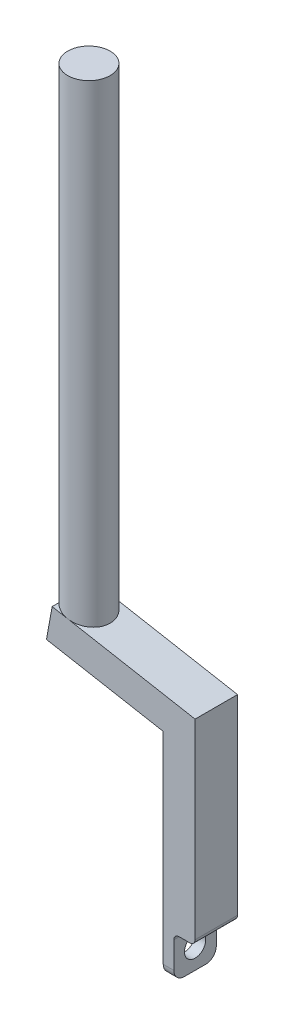
ISO-10303-21;
HEADER;
FILE_DESCRIPTION(('STEP AP214'),'2;1');
FILE_NAME('part.step','',(''),(''),'','','');
FILE_SCHEMA(('AUTOMOTIVE_DESIGN { 1 0 10303 214 1 1 1 1 }'));
ENDSEC;
DATA;
#1=APPLICATION_CONTEXT('core data for automotive mechanical design processes');
#2=APPLICATION_PROTOCOL_DEFINITION('international standard','automotive_design',2000,#1);
#3=PRODUCT_CONTEXT('',#1,'mechanical');
#4=PRODUCT('Part','Part','',(#3));
#5=PRODUCT_RELATED_PRODUCT_CATEGORY('part','',(#4));
#6=PRODUCT_DEFINITION_FORMATION('','',#4);
#7=PRODUCT_DEFINITION_CONTEXT('part definition',#1,'design');
#8=PRODUCT_DEFINITION('design','',#6,#7);
#9=PRODUCT_DEFINITION_SHAPE('','',#8);
#10=(LENGTH_UNIT() NAMED_UNIT(*) SI_UNIT(.MILLI.,.METRE.));
#11=(NAMED_UNIT(*) PLANE_ANGLE_UNIT() SI_UNIT($,.RADIAN.));
#12=(NAMED_UNIT(*) SI_UNIT($,.STERADIAN.) SOLID_ANGLE_UNIT());
#13=UNCERTAINTY_MEASURE_WITH_UNIT(LENGTH_MEASURE(1.E-05),#10,'distance_accuracy_value','');
#14=(GEOMETRIC_REPRESENTATION_CONTEXT(3) GLOBAL_UNCERTAINTY_ASSIGNED_CONTEXT((#13)) GLOBAL_UNIT_ASSIGNED_CONTEXT((#10,
#11,#12)) REPRESENTATION_CONTEXT('',''));
#15=CARTESIAN_POINT('',(0.,0.,0.));
#16=DIRECTION('',(0.,0.,1.));
#17=DIRECTION('',(1.,0.,0.));
#18=AXIS2_PLACEMENT_3D('',#15,#16,#17);
#19=CARTESIAN_POINT('',(-14.6334368540004,29.5160973029974,-20.));
#20=DIRECTION('',(0.178885438199985,0.983869910099907,0.));
#21=DIRECTION('',(-0.983869910099907,0.178885438199985,0.));
#22=AXIS2_PLACEMENT_3D('',#19,#20,#21);
#23=PLANE('',#22);
#24=CARTESIAN_POINT('',(0.,26.8554724204519,0.));
#25=DIRECTION('',(0.178885438199985,0.983869910099907,0.));
#26=DIRECTION('',(0.983869910099907,-0.178885438199985,0.));
#27=AXIS2_PLACEMENT_3D('',#24,#25,#26);
#28=ELLIPSE('',#27,20.3278907045436,20.);
#29=CARTESIAN_POINT('',(0.,26.8554724204519,-20.));
#30=VERTEX_POINT('',#29);
#31=CARTESIAN_POINT('',(-14.6334368540004,29.5160973029974,-13.6331407181171));
#32=VERTEX_POINT('',#31);
#33=EDGE_CURVE('E209',#30,#32,#28,.T.);
#34=ORIENTED_EDGE('',*,*,#33,.F.);
#35=DIRECTION('',(-0.983869910099907,0.178885438199985,0.));
#36=VECTOR('',#35,1.);
#37=CARTESIAN_POINT('',(-14.6334368540004,29.5160973029974,-20.));
#38=LINE('',#37,#36);
#39=CARTESIAN_POINT('',(-14.6334368540004,29.5160973029974,-20.));
#40=VERTEX_POINT('',#39);
#41=EDGE_CURVE('E188',#30,#40,#38,.T.);
#42=ORIENTED_EDGE('',*,*,#41,.T.);
#43=DIRECTION('',(0.,0.,1.));
#44=VECTOR('',#43,1.);
#45=CARTESIAN_POINT('',(-14.6334368540004,29.5160973029974,-20.));
#46=LINE('',#45,#44);
#47=EDGE_CURVE('E190',#40,#32,#46,.T.);
#48=ORIENTED_EDGE('',*,*,#47,.T.);
#49=EDGE_LOOP('',(#34,#42,#48));
#50=FACE_BOUND('',#49,.T.);
#51=ADVANCED_FACE('F33',(#50),#23,.T.);
#52=CARTESIAN_POINT('',(-14.6334368540004,29.5160973029974,13.6331407181171));
#53=VERTEX_POINT('',#52);
#54=CARTESIAN_POINT('',(0.,26.8554724204519,20.));
#55=VERTEX_POINT('',#54);
#56=EDGE_CURVE('E210',#53,#55,#28,.T.);
#57=ORIENTED_EDGE('',*,*,#56,.F.);
#58=CARTESIAN_POINT('',(-14.6334368540004,29.5160973029974,20.));
#59=VERTEX_POINT('',#58);
#60=EDGE_CURVE('E194',#53,#59,#46,.T.);
#61=ORIENTED_EDGE('',*,*,#60,.T.);
#62=DIRECTION('',(-0.983869910099907,0.178885438199985,0.));
#63=VECTOR('',#62,1.);
#64=CARTESIAN_POINT('',(-14.6334368540004,29.5160973029974,20.));
#65=LINE('',#64,#63);
#66=EDGE_CURVE('E166',#55,#59,#65,.T.);
#67=ORIENTED_EDGE('',*,*,#66,.F.);
#68=EDGE_LOOP('',(#57,#61,#67));
#69=FACE_BOUND('',#68,.T.);
#70=ADVANCED_FACE('F310',(#69),#23,.T.);
#71=CARTESIAN_POINT('',(-20.,0.,-20.));
#72=DIRECTION('',(-0.983869910099907,0.178885438199984,0.));
#73=DIRECTION('',(-0.178885438199984,-0.983869910099907,0.));
#74=AXIS2_PLACEMENT_3D('',#71,#72,#73);
#75=PLANE('',#74);
#76=CARTESIAN_POINT('',(0.,110.,0.));
#77=DIRECTION('',(-0.983869910099907,0.178885438199984,0.));
#78=DIRECTION('',(-0.178885438199984,-0.983869910099907,0.));
#79=AXIS2_PLACEMENT_3D('',#76,#77,#78);
#80=ELLIPSE('',#79,111.803398874989,20.);
#81=CARTESIAN_POINT('',(-20.,0.,0.));
#82=VERTEX_POINT('',#81);
#83=EDGE_CURVE('E148',#82,#53,#80,.T.);
#84=ORIENTED_EDGE('',*,*,#83,.F.);
#85=DIRECTION('',(0.,0.,1.));
#86=VECTOR('',#85,1.);
#87=CARTESIAN_POINT('',(-20.,0.,-20.));
#88=LINE('',#87,#86);
#89=CARTESIAN_POINT('',(-20.,0.,20.));
#90=VERTEX_POINT('',#89);
#91=EDGE_CURVE('E141',#82,#90,#88,.T.);
#92=ORIENTED_EDGE('',*,*,#91,.T.);
#93=DIRECTION('',(-0.178885438199984,-0.983869910099907,0.));
#94=VECTOR('',#93,1.);
#95=CARTESIAN_POINT('',(-20.,0.,20.));
#96=LINE('',#95,#94);
#97=EDGE_CURVE('E146',#59,#90,#96,.T.);
#98=ORIENTED_EDGE('',*,*,#97,.F.);
#99=ORIENTED_EDGE('',*,*,#60,.F.);
#100=EDGE_LOOP('',(#84,#92,#98,#99));
#101=FACE_BOUND('',#100,.T.);
#102=ADVANCED_FACE('F143',(#101),#75,.T.);
#103=EDGE_CURVE('E193',#32,#82,#80,.T.);
#104=ORIENTED_EDGE('',*,*,#103,.F.);
#105=ORIENTED_EDGE('',*,*,#47,.F.);
#106=DIRECTION('',(-0.178885438199984,-0.983869910099907,0.));
#107=VECTOR('',#106,1.);
#108=CARTESIAN_POINT('',(-20.,0.,-20.));
#109=LINE('',#108,#107);
#110=CARTESIAN_POINT('',(-20.,0.,-20.));
#111=VERTEX_POINT('',#110);
#112=EDGE_CURVE('E179',#40,#111,#109,.T.);
#113=ORIENTED_EDGE('',*,*,#112,.T.);
#114=EDGE_CURVE('E151',#111,#82,#88,.T.);
#115=ORIENTED_EDGE('',*,*,#114,.T.);
#116=EDGE_LOOP('',(#104,#105,#113,#115));
#117=FACE_BOUND('',#116,.T.);
#118=ADVANCED_FACE('F301',(#117),#75,.T.);
#119=EDGE_CURVE('E206',#55,#30,#28,.T.);
#120=ORIENTED_EDGE('',*,*,#119,.F.);
#121=CARTESIAN_POINT('',(120.,5.03729060226981,20.));
#122=VERTEX_POINT('',#121);
#123=EDGE_CURVE('E177',#122,#55,#65,.T.);
#124=ORIENTED_EDGE('',*,*,#123,.F.);
#125=DIRECTION('',(0.,0.,1.));
#126=VECTOR('',#125,1.);
#127=CARTESIAN_POINT('',(120.,5.03729060226981,-20.));
#128=LINE('',#127,#126);
#129=CARTESIAN_POINT('',(120.,5.03729060226981,-20.));
#130=VERTEX_POINT('',#129);
#131=EDGE_CURVE('E195',#130,#122,#128,.T.);
#132=ORIENTED_EDGE('',*,*,#131,.F.);
#133=EDGE_CURVE('E152',#130,#30,#38,.T.);
#134=ORIENTED_EDGE('',*,*,#133,.T.);
#135=EDGE_LOOP('',(#120,#124,#132,#134));
#136=FACE_BOUND('',#135,.T.);
#137=ADVANCED_FACE('F289',(#136),#23,.T.);
#138=CARTESIAN_POINT('',(120.,5.03729060226981,-20.));
#139=DIRECTION('',(1.,0.,0.));
#140=DIRECTION('',(0.,1.,0.));
#141=AXIS2_PLACEMENT_3D('',#138,#139,#140);
#142=PLANE('',#141);
#143=DIRECTION('',(0.,1.,0.));
#144=VECTOR('',#143,1.);
#145=CARTESIAN_POINT('',(120.,5.03729060226981,20.));
#146=LINE('',#145,#144);
#147=CARTESIAN_POINT('',(120.,-175.,20.));
#148=VERTEX_POINT('',#147);
#149=EDGE_CURVE('E175',#148,#122,#146,.T.);
#150=ORIENTED_EDGE('',*,*,#149,.F.);
#151=DIRECTION('',(0.,0.,1.));
#152=VECTOR('',#151,1.);
#153=CARTESIAN_POINT('',(120.,-175.,-20.));
#154=LINE('',#153,#152);
#155=CARTESIAN_POINT('',(120.,-175.,-20.));
#156=VERTEX_POINT('',#155);
#157=EDGE_CURVE('E221',#148,#156,#154,.F.);
#158=ORIENTED_EDGE('',*,*,#157,.T.);
#159=DIRECTION('',(0.,1.,0.));
#160=VECTOR('',#159,1.);
#161=CARTESIAN_POINT('',(120.,5.03729060226981,-20.));
#162=LINE('',#161,#160);
#163=EDGE_CURVE('E186',#156,#130,#162,.T.);
#164=ORIENTED_EDGE('',*,*,#163,.T.);
#165=ORIENTED_EDGE('',*,*,#131,.T.);
#166=EDGE_LOOP('',(#150,#158,#164,#165));
#167=FACE_BOUND('',#166,.T.);
#168=ADVANCED_FACE('F283',(#167),#142,.T.);
#169=CARTESIAN_POINT('',(90.,-220.,-20.));
#170=DIRECTION('',(0.,-1.,0.));
#171=DIRECTION('',(0.,0.,-1.));
#172=AXIS2_PLACEMENT_3D('',#169,#170,#171);
#173=PLANE('',#172);
#174=DIRECTION('',(0.,0.,1.));
#175=VECTOR('',#174,1.);
#176=CARTESIAN_POINT('',(90.,-220.,-20.));
#177=LINE('',#176,#175);
#178=CARTESIAN_POINT('',(90.,-220.,-10.));
#179=VERTEX_POINT('',#178);
#180=CARTESIAN_POINT('',(90.,-220.,10.));
#181=VERTEX_POINT('',#180);
#182=EDGE_CURVE('E198',#179,#181,#177,.T.);
#183=ORIENTED_EDGE('',*,*,#182,.F.);
#184=DIRECTION('',(1.,0.,0.));
#185=VECTOR('',#184,1.);
#186=CARTESIAN_POINT('',(90.,-220.,-10.));
#187=LINE('',#186,#185);
#188=CARTESIAN_POINT('',(100.,-220.,-10.));
#189=VERTEX_POINT('',#188);
#190=EDGE_CURVE('E235',#179,#189,#187,.T.);
#191=ORIENTED_EDGE('',*,*,#190,.T.);
#192=DIRECTION('',(0.,0.,-1.));
#193=VECTOR('',#192,1.);
#194=CARTESIAN_POINT('',(100.,-220.,-20.));
#195=LINE('',#194,#193);
#196=CARTESIAN_POINT('',(100.,-220.,10.));
#197=VERTEX_POINT('',#196);
#198=EDGE_CURVE('E258',#197,#189,#195,.T.);
#199=ORIENTED_EDGE('',*,*,#198,.F.);
#200=DIRECTION('',(1.,0.,0.));
#201=VECTOR('',#200,1.);
#202=CARTESIAN_POINT('',(90.,-220.,10.));
#203=LINE('',#202,#201);
#204=EDGE_CURVE('E233',#197,#181,#203,.F.);
#205=ORIENTED_EDGE('',*,*,#204,.T.);
#206=EDGE_LOOP('',(#183,#191,#199,#205));
#207=FACE_BOUND('',#206,.T.);
#208=ADVANCED_FACE('F249',(#207),#173,.T.);
#209=CARTESIAN_POINT('',(90.,-20.,-20.));
#210=DIRECTION('',(-1.,0.,0.));
#211=DIRECTION('',(0.,-1.,0.));
#212=AXIS2_PLACEMENT_3D('',#209,#210,#211);
#213=PLANE('',#212);
#214=CARTESIAN_POINT('',(90.,-200.,0.));
#215=DIRECTION('',(-1.,0.,0.));
#216=DIRECTION('',(0.,-1.,0.));
#217=AXIS2_PLACEMENT_3D('',#214,#215,#216);
#218=CIRCLE('',#217,10.);
#219=CARTESIAN_POINT('',(90.,-210.,0.));
#220=VERTEX_POINT('',#219);
#221=EDGE_CURVE('E167',#220,#220,#218,.T.);
#222=ORIENTED_EDGE('',*,*,#221,.F.);
#223=EDGE_LOOP('',(#222));
#224=FACE_BOUND('',#223,.T.);
#225=DIRECTION('',(0.,-1.,0.));
#226=VECTOR('',#225,1.);
#227=CARTESIAN_POINT('',(90.,-20.,-20.));
#228=LINE('',#227,#226);
#229=CARTESIAN_POINT('',(90.,-20.,-20.));
#230=VERTEX_POINT('',#229);
#231=CARTESIAN_POINT('',(90.,-210.,-20.));
#232=VERTEX_POINT('',#231);
#233=EDGE_CURVE('E184',#230,#232,#228,.T.);
#234=ORIENTED_EDGE('',*,*,#233,.T.);
#235=CARTESIAN_POINT('',(90.,-210.,-10.));
#236=DIRECTION('',(-1.,0.,0.));
#237=DIRECTION('',(0.,-1.,0.));
#238=AXIS2_PLACEMENT_3D('',#235,#236,#237);
#239=CIRCLE('',#238,10.);
#240=EDGE_CURVE('E41',#232,#179,#239,.T.);
#241=ORIENTED_EDGE('',*,*,#240,.T.);
#242=ORIENTED_EDGE('',*,*,#182,.T.);
#243=CARTESIAN_POINT('',(90.,-210.,10.));
#244=DIRECTION('',(-1.,0.,0.));
#245=DIRECTION('',(0.,-1.,0.));
#246=AXIS2_PLACEMENT_3D('',#243,#244,#245);
#247=CIRCLE('',#246,10.);
#248=CARTESIAN_POINT('',(90.,-210.,20.));
#249=VERTEX_POINT('',#248);
#250=EDGE_CURVE('E48',#181,#249,#247,.T.);
#251=ORIENTED_EDGE('',*,*,#250,.T.);
#252=DIRECTION('',(0.,-1.,0.));
#253=VECTOR('',#252,1.);
#254=CARTESIAN_POINT('',(90.,-20.,20.));
#255=LINE('',#254,#253);
#256=CARTESIAN_POINT('',(90.,-20.,20.));
#257=VERTEX_POINT('',#256);
#258=EDGE_CURVE('E160',#257,#249,#255,.T.);
#259=ORIENTED_EDGE('',*,*,#258,.F.);
#260=DIRECTION('',(0.,0.,1.));
#261=VECTOR('',#260,1.);
#262=CARTESIAN_POINT('',(90.,-20.,-20.));
#263=LINE('',#262,#261);
#264=EDGE_CURVE('E158',#230,#257,#263,.T.);
#265=ORIENTED_EDGE('',*,*,#264,.F.);
#266=EDGE_LOOP('',(#234,#241,#242,#251,#259,#265));
#267=FACE_BOUND('',#266,.T.);
#268=ADVANCED_FACE('F245',(#224,#267),#213,.T.);
#269=CARTESIAN_POINT('',(-20.,0.,-20.));
#270=DIRECTION('',(-0.178885438199983,-0.983869910099907,0.));
#271=DIRECTION('',(0.983869910099907,-0.178885438199983,0.));
#272=AXIS2_PLACEMENT_3D('',#269,#270,#271);
#273=PLANE('',#272);
#274=ORIENTED_EDGE('',*,*,#264,.T.);
#275=DIRECTION('',(0.983869910099908,-0.178885438199983,0.));
#276=VECTOR('',#275,1.);
#277=CARTESIAN_POINT('',(-20.,0.,20.));
#278=LINE('',#277,#276);
#279=EDGE_CURVE('E155',#90,#257,#278,.T.);
#280=ORIENTED_EDGE('',*,*,#279,.F.);
#281=ORIENTED_EDGE('',*,*,#91,.F.);
#282=ORIENTED_EDGE('',*,*,#114,.F.);
#283=DIRECTION('',(0.983869910099908,-0.178885438199983,0.));
#284=VECTOR('',#283,1.);
#285=CARTESIAN_POINT('',(-20.,0.,-20.));
#286=LINE('',#285,#284);
#287=EDGE_CURVE('E182',#111,#230,#286,.T.);
#288=ORIENTED_EDGE('',*,*,#287,.T.);
#289=EDGE_LOOP('',(#274,#280,#281,#282,#288));
#290=FACE_BOUND('',#289,.T.);
#291=ADVANCED_FACE('F156',(#290),#273,.T.);
#292=CARTESIAN_POINT('',(0.,0.,-20.));
#293=DIRECTION('',(0.,0.,-1.));
#294=DIRECTION('',(-1.,0.,0.));
#295=AXIS2_PLACEMENT_3D('',#292,#293,#294);
#296=PLANE('',#295);
#297=DIRECTION('',(0.,1.,0.));
#298=VECTOR('',#297,1.);
#299=CARTESIAN_POINT('',(100.,-180.,-20.));
#300=LINE('',#299,#298);
#301=CARTESIAN_POINT('',(100.,-210.,-20.));
#302=VERTEX_POINT('',#301);
#303=CARTESIAN_POINT('',(100.,-185.,-20.));
#304=VERTEX_POINT('',#303);
#305=EDGE_CURVE('E257',#302,#304,#300,.T.);
#306=ORIENTED_EDGE('',*,*,#305,.F.);
#307=DIRECTION('',(1.,0.,0.));
#308=VECTOR('',#307,1.);
#309=CARTESIAN_POINT('',(0.,-210.,-20.));
#310=LINE('',#309,#308);
#311=EDGE_CURVE('E56',#302,#232,#310,.F.);
#312=ORIENTED_EDGE('',*,*,#311,.T.);
#313=ORIENTED_EDGE('',*,*,#233,.F.);
#314=ORIENTED_EDGE('',*,*,#287,.F.);
#315=ORIENTED_EDGE('',*,*,#112,.F.);
#316=ORIENTED_EDGE('',*,*,#41,.F.);
#317=ORIENTED_EDGE('',*,*,#133,.F.);
#318=ORIENTED_EDGE('',*,*,#163,.F.);
#319=CARTESIAN_POINT('',(115.,-175.,-20.));
#320=DIRECTION('',(0.,0.,-1.));
#321=DIRECTION('',(-1.,0.,0.));
#322=AXIS2_PLACEMENT_3D('',#319,#320,#321);
#323=CIRCLE('',#322,5.);
#324=CARTESIAN_POINT('',(115.,-180.,-20.));
#325=VERTEX_POINT('',#324);
#326=EDGE_CURVE('E223',#156,#325,#323,.T.);
#327=ORIENTED_EDGE('',*,*,#326,.T.);
#328=DIRECTION('',(1.,0.,0.));
#329=VECTOR('',#328,1.);
#330=CARTESIAN_POINT('',(100.,-180.,-20.));
#331=LINE('',#330,#329);
#332=CARTESIAN_POINT('',(105.,-180.,-20.));
#333=VERTEX_POINT('',#332);
#334=EDGE_CURVE('E269',#333,#325,#331,.T.);
#335=ORIENTED_EDGE('',*,*,#334,.F.);
#336=CARTESIAN_POINT('',(105.,-185.,-20.));
#337=DIRECTION('',(0.,0.,-1.));
#338=DIRECTION('',(-1.,0.,0.));
#339=AXIS2_PLACEMENT_3D('',#336,#337,#338);
#340=CIRCLE('',#339,5.);
#341=EDGE_CURVE('E230',#333,#304,#340,.F.);
#342=ORIENTED_EDGE('',*,*,#341,.T.);
#343=EDGE_LOOP('',(#306,#312,#313,#314,#315,#316,#317,#318,#327,#335,#342));
#344=FACE_BOUND('',#343,.T.);
#345=ADVANCED_FACE('F259',(#344),#296,.T.);
#346=CARTESIAN_POINT('',(0.,0.,20.));
#347=DIRECTION('',(0.,0.,-1.));
#348=DIRECTION('',(-1.,0.,0.));
#349=AXIS2_PLACEMENT_3D('',#346,#347,#348);
#350=PLANE('',#349);
#351=ORIENTED_EDGE('',*,*,#258,.T.);
#352=DIRECTION('',(1.,0.,0.));
#353=VECTOR('',#352,1.);
#354=CARTESIAN_POINT('',(100.,-210.,20.));
#355=LINE('',#354,#353);
#356=CARTESIAN_POINT('',(100.,-210.,20.));
#357=VERTEX_POINT('',#356);
#358=EDGE_CURVE('E11',#249,#357,#355,.T.);
#359=ORIENTED_EDGE('',*,*,#358,.T.);
#360=DIRECTION('',(0.,-1.,0.));
#361=VECTOR('',#360,1.);
#362=CARTESIAN_POINT('',(100.,-220.,20.));
#363=LINE('',#362,#361);
#364=CARTESIAN_POINT('',(100.,-185.,20.));
#365=VERTEX_POINT('',#364);
#366=EDGE_CURVE('E263',#365,#357,#363,.T.);
#367=ORIENTED_EDGE('',*,*,#366,.F.);
#368=CARTESIAN_POINT('',(105.,-185.,20.));
#369=DIRECTION('',(0.,0.,-1.));
#370=DIRECTION('',(-1.,0.,0.));
#371=AXIS2_PLACEMENT_3D('',#368,#369,#370);
#372=CIRCLE('',#371,5.);
#373=CARTESIAN_POINT('',(105.,-180.,20.));
#374=VERTEX_POINT('',#373);
#375=EDGE_CURVE('E228',#365,#374,#372,.T.);
#376=ORIENTED_EDGE('',*,*,#375,.T.);
#377=DIRECTION('',(1.,0.,0.));
#378=VECTOR('',#377,1.);
#379=CARTESIAN_POINT('',(100.,-180.,20.));
#380=LINE('',#379,#378);
#381=CARTESIAN_POINT('',(115.,-180.,20.));
#382=VERTEX_POINT('',#381);
#383=EDGE_CURVE('E213',#374,#382,#380,.T.);
#384=ORIENTED_EDGE('',*,*,#383,.T.);
#385=CARTESIAN_POINT('',(115.,-175.,20.));
#386=DIRECTION('',(0.,0.,-1.));
#387=DIRECTION('',(-1.,0.,0.));
#388=AXIS2_PLACEMENT_3D('',#385,#386,#387);
#389=CIRCLE('',#388,5.);
#390=EDGE_CURVE('E219',#382,#148,#389,.F.);
#391=ORIENTED_EDGE('',*,*,#390,.T.);
#392=ORIENTED_EDGE('',*,*,#149,.T.);
#393=ORIENTED_EDGE('',*,*,#123,.T.);
#394=ORIENTED_EDGE('',*,*,#66,.T.);
#395=ORIENTED_EDGE('',*,*,#97,.T.);
#396=ORIENTED_EDGE('',*,*,#279,.T.);
#397=EDGE_LOOP('',(#351,#359,#367,#376,#384,#391,#392,#393,#394,#395,#396));
#398=FACE_BOUND('',#397,.T.);
#399=ADVANCED_FACE('F163',(#398),#350,.F.);
#400=CARTESIAN_POINT('',(0.,470.,0.));
#401=DIRECTION('',(0.,-1.,0.));
#402=DIRECTION('',(0.,0.,-1.));
#403=AXIS2_PLACEMENT_3D('',#400,#401,#402);
#404=CYLINDRICAL_SURFACE('',#403,20.);
#405=CARTESIAN_POINT('',(0.,470.,0.));
#406=DIRECTION('',(0.,1.,0.));
#407=DIRECTION('',(0.,0.,1.));
#408=AXIS2_PLACEMENT_3D('',#405,#406,#407);
#409=CIRCLE('',#408,20.);
#410=CARTESIAN_POINT('',(0.,470.,20.));
#411=VERTEX_POINT('',#410);
#412=EDGE_CURVE('E203',#411,#411,#409,.T.);
#413=ORIENTED_EDGE('',*,*,#412,.F.);
#414=EDGE_LOOP('',(#413));
#415=FACE_BOUND('',#414,.T.);
#416=ORIENTED_EDGE('',*,*,#83,.T.);
#417=ORIENTED_EDGE('',*,*,#56,.T.);
#418=ORIENTED_EDGE('',*,*,#119,.T.);
#419=ORIENTED_EDGE('',*,*,#33,.T.);
#420=ORIENTED_EDGE('',*,*,#103,.T.);
#421=EDGE_LOOP('',(#416,#417,#418,#419,#420));
#422=FACE_BOUND('',#421,.T.);
#423=ADVANCED_FACE('F292',(#415,#422),#404,.T.);
#424=CARTESIAN_POINT('',(0.,470.,0.));
#425=DIRECTION('',(0.,1.,0.));
#426=DIRECTION('',(0.,0.,1.));
#427=AXIS2_PLACEMENT_3D('',#424,#425,#426);
#428=PLANE('',#427);
#429=ORIENTED_EDGE('',*,*,#412,.T.);
#430=EDGE_LOOP('',(#429));
#431=FACE_BOUND('',#430,.T.);
#432=ADVANCED_FACE('F336',(#431),#428,.T.);
#433=CARTESIAN_POINT('',(120.001,-200.,0.));
#434=DIRECTION('',(-1.,0.,0.));
#435=DIRECTION('',(0.,-1.,0.));
#436=AXIS2_PLACEMENT_3D('',#433,#434,#435);
#437=CYLINDRICAL_SURFACE('',#436,10.);
#438=CARTESIAN_POINT('',(100.,-200.,0.));
#439=DIRECTION('',(-1.,0.,0.));
#440=DIRECTION('',(0.,0.,1.));
#441=AXIS2_PLACEMENT_3D('',#438,#439,#440);
#442=CIRCLE('',#441,10.);
#443=CARTESIAN_POINT('',(100.,-210.,0.));
#444=VERTEX_POINT('',#443);
#445=EDGE_CURVE('E170',#444,#444,#442,.F.);
#446=CARTESIAN_POINT('',(100.,-210.,0.));
#447=CARTESIAN_POINT('',(99.8958333333333,-210.,0.));
#448=CARTESIAN_POINT('',(99.7916666666667,-210.,0.));
#449=CARTESIAN_POINT('',(99.5833333333333,-210.,0.));
#450=CARTESIAN_POINT('',(99.4791666666667,-210.,0.));
#451=CARTESIAN_POINT('',(99.2708333333333,-210.,0.));
#452=CARTESIAN_POINT('',(99.1666666666667,-210.,0.));
#453=CARTESIAN_POINT('',(98.9583333333333,-210.,0.));
#454=CARTESIAN_POINT('',(98.8541666666667,-210.,0.));
#455=CARTESIAN_POINT('',(98.6458333333333,-210.,0.));
#456=CARTESIAN_POINT('',(98.5416666666667,-210.,0.));
#457=CARTESIAN_POINT('',(98.3333333333333,-210.,0.));
#458=CARTESIAN_POINT('',(98.2291666666667,-210.,0.));
#459=CARTESIAN_POINT('',(98.0208333333333,-210.,0.));
#460=CARTESIAN_POINT('',(97.9166666666667,-210.,0.));
#461=CARTESIAN_POINT('',(97.7083333333333,-210.,0.));
#462=CARTESIAN_POINT('',(97.6041666666667,-210.,0.));
#463=CARTESIAN_POINT('',(97.3958333333333,-210.,0.));
#464=CARTESIAN_POINT('',(97.2916666666667,-210.,0.));
#465=CARTESIAN_POINT('',(97.0833333333333,-210.,0.));
#466=CARTESIAN_POINT('',(96.9791666666667,-210.,0.));
#467=CARTESIAN_POINT('',(96.7708333333333,-210.,0.));
#468=CARTESIAN_POINT('',(96.6666666666667,-210.,0.));
#469=CARTESIAN_POINT('',(96.4583333333333,-210.,0.));
#470=CARTESIAN_POINT('',(96.3541666666667,-210.,0.));
#471=CARTESIAN_POINT('',(96.1458333333333,-210.,0.));
#472=CARTESIAN_POINT('',(96.0416666666667,-210.,0.));
#473=CARTESIAN_POINT('',(95.8333333333333,-210.,0.));
#474=CARTESIAN_POINT('',(95.7291666666667,-210.,0.));
#475=CARTESIAN_POINT('',(95.5208333333333,-210.,0.));
#476=CARTESIAN_POINT('',(95.4166666666667,-210.,0.));
#477=CARTESIAN_POINT('',(95.2083333333333,-210.,0.));
#478=CARTESIAN_POINT('',(95.1041666666667,-210.,0.));
#479=CARTESIAN_POINT('',(94.8958333333333,-210.,0.));
#480=CARTESIAN_POINT('',(94.7916666666667,-210.,0.));
#481=CARTESIAN_POINT('',(94.5833333333334,-210.,0.));
#482=CARTESIAN_POINT('',(94.4791666666667,-210.,0.));
#483=CARTESIAN_POINT('',(94.2708333333333,-210.,0.));
#484=CARTESIAN_POINT('',(94.1666666666667,-210.,0.));
#485=CARTESIAN_POINT('',(93.9583333333334,-210.,0.));
#486=CARTESIAN_POINT('',(93.8541666666667,-210.,0.));
#487=CARTESIAN_POINT('',(93.6458333333334,-210.,0.));
#488=CARTESIAN_POINT('',(93.5416666666667,-210.,0.));
#489=CARTESIAN_POINT('',(93.3333333333334,-210.,0.));
#490=CARTESIAN_POINT('',(93.2291666666667,-210.,0.));
#491=CARTESIAN_POINT('',(93.0208333333334,-210.,0.));
#492=CARTESIAN_POINT('',(92.9166666666667,-210.,0.));
#493=CARTESIAN_POINT('',(92.7083333333334,-210.,0.));
#494=CARTESIAN_POINT('',(92.6041666666667,-210.,0.));
#495=CARTESIAN_POINT('',(92.3958333333334,-210.,0.));
#496=CARTESIAN_POINT('',(92.2916666666667,-210.,0.));
#497=CARTESIAN_POINT('',(92.0833333333334,-210.,0.));
#498=CARTESIAN_POINT('',(91.9791666666667,-210.,0.));
#499=CARTESIAN_POINT('',(91.7708333333334,-210.,0.));
#500=CARTESIAN_POINT('',(91.6666666666667,-210.,0.));
#501=CARTESIAN_POINT('',(91.4583333333334,-210.,0.));
#502=CARTESIAN_POINT('',(91.3541666666667,-210.,0.));
#503=CARTESIAN_POINT('',(91.1458333333334,-210.,0.));
#504=CARTESIAN_POINT('',(91.0416666666667,-210.,0.));
#505=CARTESIAN_POINT('',(90.8333333333334,-210.,0.));
#506=CARTESIAN_POINT('',(90.7291666666667,-210.,0.));
#507=CARTESIAN_POINT('',(90.5208333333334,-210.,0.));
#508=CARTESIAN_POINT('',(90.4166666666667,-210.,0.));
#509=CARTESIAN_POINT('',(90.2083333333334,-210.,0.));
#510=CARTESIAN_POINT('',(90.1041666666667,-210.,0.));
#511=CARTESIAN_POINT('',(90.,-210.,0.));
#512=B_SPLINE_CURVE_WITH_KNOTS('',3,(#446,#447,#448,#449,#450,#451,#452,#453,#454,#455,#456,
#457,#458,#459,#460,#461,#462,#463,#464,#465,#466,#467,#468,#469,#470,#471,#472,#473,#474,#475,
#476,#477,#478,#479,#480,#481,#482,#483,#484,#485,#486,#487,#488,#489,#490,#491,#492,#493,#494,
#495,#496,#497,#498,#499,#500,#501,#502,#503,#504,#505,#506,#507,#508,#509,#510,#511),
.UNSPECIFIED.,.F.,.F.,(4,2,2,2,2,2,2,2,2,2,2,2,2,2,2,2,2,2,2,2,2,2,2,2,2,2,2,2,2,2,2,2,4),(0.,
0.312499999999993,0.625000000000001,0.937499999999994,1.24999999999999,1.56249999999999,
1.87499999999999,2.1875,2.49999999999999,2.81249999999998,3.12499999999999,3.43749999999998,
3.74999999999999,4.06249999999998,4.37499999999998,4.68749999999998,4.99999999999998,
5.31249999999997,5.62499999999998,5.93749999999997,6.24999999999996,6.56249999999997,
6.87499999999996,7.18749999999997,7.49999999999997,7.81249999999996,8.12499999999997,
8.43749999999996,8.74999999999997,9.06249999999996,9.37499999999995,9.68749999999996,
9.99999999999995),.UNSPECIFIED.);
#513=EDGE_CURVE('BSEAM340',#444,#220,#512,.T.);
#514=ORIENTED_EDGE('',*,*,#445,.T.);
#515=ORIENTED_EDGE('',*,*,#221,.T.);
#516=ORIENTED_EDGE('',*,*,#513,.T.);
#517=ORIENTED_EDGE('',*,*,#513,.F.);
#518=EDGE_LOOP('',(#514,#516,#515,#517));
#519=FACE_BOUND('',#518,.T.);
#520=ADVANCED_FACE('F340',(#519),#437,.F.);
#521=CARTESIAN_POINT('',(100.,0.,0.));
#522=DIRECTION('',(-1.,0.,0.));
#523=DIRECTION('',(0.,0.,1.));
#524=AXIS2_PLACEMENT_3D('',#521,#522,#523);
#525=PLANE('',#524);
#526=ORIENTED_EDGE('',*,*,#198,.T.);
#527=CARTESIAN_POINT('',(100.,-210.,-10.));
#528=DIRECTION('',(-1.,0.,0.));
#529=DIRECTION('',(0.,0.,1.));
#530=AXIS2_PLACEMENT_3D('',#527,#528,#529);
#531=CIRCLE('',#530,10.);
#532=EDGE_CURVE('E240',#189,#302,#531,.F.);
#533=ORIENTED_EDGE('',*,*,#532,.T.);
#534=ORIENTED_EDGE('',*,*,#305,.T.);
#535=DIRECTION('',(0.,0.,1.));
#536=VECTOR('',#535,1.);
#537=CARTESIAN_POINT('',(100.,-185.,20.));
#538=LINE('',#537,#536);
#539=EDGE_CURVE('E225',#304,#365,#538,.T.);
#540=ORIENTED_EDGE('',*,*,#539,.T.);
#541=ORIENTED_EDGE('',*,*,#366,.T.);
#542=CARTESIAN_POINT('',(100.,-210.,10.));
#543=DIRECTION('',(-1.,0.,0.));
#544=DIRECTION('',(0.,0.,1.));
#545=AXIS2_PLACEMENT_3D('',#542,#543,#544);
#546=CIRCLE('',#545,10.);
#547=EDGE_CURVE('E238',#357,#197,#546,.F.);
#548=ORIENTED_EDGE('',*,*,#547,.T.);
#549=EDGE_LOOP('',(#526,#533,#534,#540,#541,#548));
#550=FACE_BOUND('',#549,.T.);
#551=ORIENTED_EDGE('',*,*,#445,.F.);
#552=EDGE_LOOP('',(#551));
#553=FACE_BOUND('',#552,.T.);
#554=ADVANCED_FACE('F255',(#550,#553),#525,.F.);
#555=CARTESIAN_POINT('',(100.,-180.,20.));
#556=DIRECTION('',(0.,1.,0.));
#557=DIRECTION('',(0.,0.,1.));
#558=AXIS2_PLACEMENT_3D('',#555,#556,#557);
#559=PLANE('',#558);
#560=ORIENTED_EDGE('',*,*,#334,.T.);
#561=DIRECTION('',(0.,0.,1.));
#562=VECTOR('',#561,1.);
#563=CARTESIAN_POINT('',(115.,-180.,20.));
#564=LINE('',#563,#562);
#565=EDGE_CURVE('E216',#325,#382,#564,.T.);
#566=ORIENTED_EDGE('',*,*,#565,.T.);
#567=ORIENTED_EDGE('',*,*,#383,.F.);
#568=DIRECTION('',(0.,0.,1.));
#569=VECTOR('',#568,1.);
#570=CARTESIAN_POINT('',(105.,-180.,-20.));
#571=LINE('',#570,#569);
#572=EDGE_CURVE('E214',#374,#333,#571,.F.);
#573=ORIENTED_EDGE('',*,*,#572,.T.);
#574=EDGE_LOOP('',(#560,#566,#567,#573));
#575=FACE_BOUND('',#574,.T.);
#576=ADVANCED_FACE('F274',(#575),#559,.F.);
#577=CARTESIAN_POINT('',(115.,-175.,20.));
#578=DIRECTION('',(0.,0.,-1.));
#579=DIRECTION('',(-1.,0.,0.));
#580=AXIS2_PLACEMENT_3D('',#577,#578,#579);
#581=CYLINDRICAL_SURFACE('',#580,5.);
#582=ORIENTED_EDGE('',*,*,#326,.F.);
#583=ORIENTED_EDGE('',*,*,#157,.F.);
#584=ORIENTED_EDGE('',*,*,#390,.F.);
#585=ORIENTED_EDGE('',*,*,#565,.F.);
#586=EDGE_LOOP('',(#582,#583,#584,#585));
#587=FACE_BOUND('',#586,.T.);
#588=ADVANCED_FACE('F279',(#587),#581,.T.);
#589=CARTESIAN_POINT('',(105.,-185.,0.));
#590=DIRECTION('',(0.,0.,-1.));
#591=DIRECTION('',(-1.,0.,0.));
#592=AXIS2_PLACEMENT_3D('',#589,#590,#591);
#593=CYLINDRICAL_SURFACE('',#592,5.);
#594=ORIENTED_EDGE('',*,*,#341,.F.);
#595=ORIENTED_EDGE('',*,*,#572,.F.);
#596=ORIENTED_EDGE('',*,*,#375,.F.);
#597=ORIENTED_EDGE('',*,*,#539,.F.);
#598=EDGE_LOOP('',(#594,#595,#596,#597));
#599=FACE_BOUND('',#598,.T.);
#600=ADVANCED_FACE('F364',(#599),#593,.F.);
#601=CARTESIAN_POINT('',(90.,-210.,-10.));
#602=DIRECTION('',(1.,0.,0.));
#603=DIRECTION('',(0.,0.,-1.));
#604=AXIS2_PLACEMENT_3D('',#601,#602,#603);
#605=CYLINDRICAL_SURFACE('',#604,10.);
#606=ORIENTED_EDGE('',*,*,#240,.F.);
#607=ORIENTED_EDGE('',*,*,#311,.F.);
#608=ORIENTED_EDGE('',*,*,#532,.F.);
#609=ORIENTED_EDGE('',*,*,#190,.F.);
#610=EDGE_LOOP('',(#606,#607,#608,#609));
#611=FACE_BOUND('',#610,.T.);
#612=ADVANCED_FACE('F253',(#611),#605,.T.);
#613=CARTESIAN_POINT('',(0.,-210.,10.));
#614=DIRECTION('',(-1.,0.,0.));
#615=DIRECTION('',(0.,0.,1.));
#616=AXIS2_PLACEMENT_3D('',#613,#614,#615);
#617=CYLINDRICAL_SURFACE('',#616,10.);
#618=ORIENTED_EDGE('',*,*,#250,.F.);
#619=ORIENTED_EDGE('',*,*,#204,.F.);
#620=ORIENTED_EDGE('',*,*,#547,.F.);
#621=ORIENTED_EDGE('',*,*,#358,.F.);
#622=EDGE_LOOP('',(#618,#619,#620,#621));
#623=FACE_BOUND('',#622,.T.);
#624=ADVANCED_FACE('F35',(#623),#617,.T.);
#625=CLOSED_SHELL('',(#51,#70,#102,#118,#137,#168,#208,#268,#291,#345,#399,#423,#432,#520,#554,
#576,#588,#600,#612,#624));
#626=MANIFOLD_SOLID_BREP('B2',#625);
#627=ADVANCED_BREP_SHAPE_REPRESENTATION('',(#18,#626),#14);
#628=SHAPE_DEFINITION_REPRESENTATION(#9,#627);
ENDSEC;
END-ISO-10303-21;
